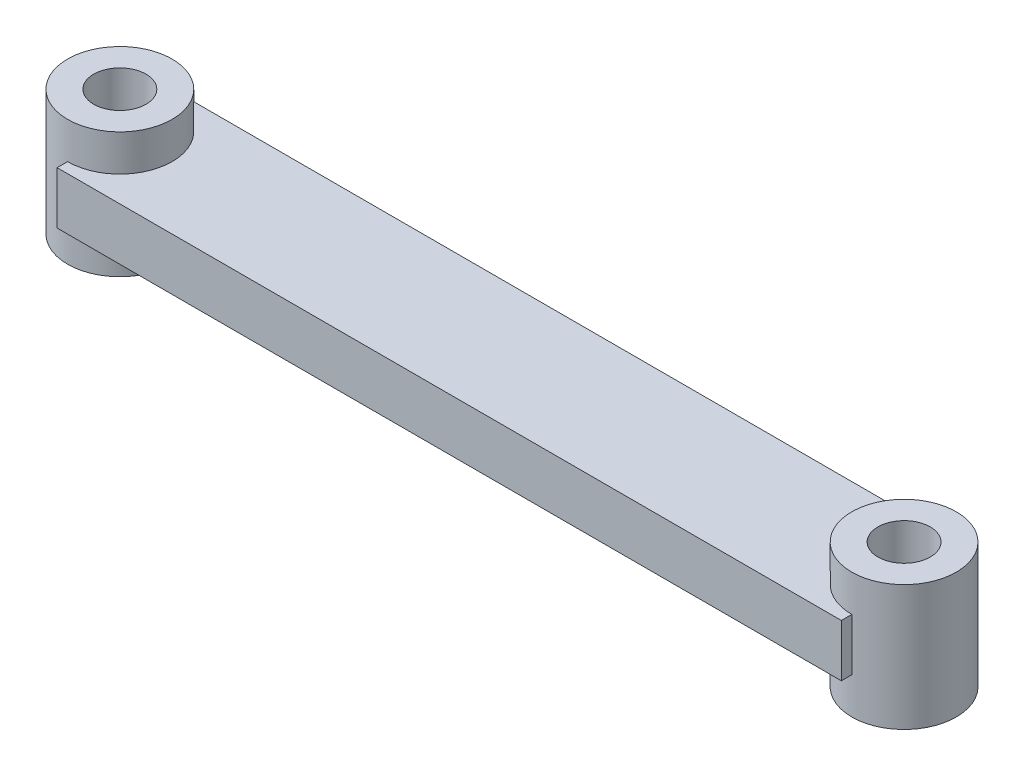
ISO-10303-21;
HEADER;
FILE_DESCRIPTION(('STEP AP214'),'2;1');
FILE_NAME('part.step','',(''),(''),'','','');
FILE_SCHEMA(('AUTOMOTIVE_DESIGN { 1 0 10303 214 1 1 1 1 }'));
ENDSEC;
DATA;
#1=APPLICATION_CONTEXT('core data for automotive mechanical design processes');
#2=APPLICATION_PROTOCOL_DEFINITION('international standard','automotive_design',2000,#1);
#3=PRODUCT_CONTEXT('',#1,'mechanical');
#4=PRODUCT('Part','Part','',(#3));
#5=PRODUCT_RELATED_PRODUCT_CATEGORY('part','',(#4));
#6=PRODUCT_DEFINITION_FORMATION('','',#4);
#7=PRODUCT_DEFINITION_CONTEXT('part definition',#1,'design');
#8=PRODUCT_DEFINITION('design','',#6,#7);
#9=PRODUCT_DEFINITION_SHAPE('','',#8);
#10=(LENGTH_UNIT() NAMED_UNIT(*) SI_UNIT(.MILLI.,.METRE.));
#11=(NAMED_UNIT(*) PLANE_ANGLE_UNIT() SI_UNIT($,.RADIAN.));
#12=(NAMED_UNIT(*) SI_UNIT($,.STERADIAN.) SOLID_ANGLE_UNIT());
#13=UNCERTAINTY_MEASURE_WITH_UNIT(LENGTH_MEASURE(1.E-05),#10,'distance_accuracy_value','');
#14=(GEOMETRIC_REPRESENTATION_CONTEXT(3) GLOBAL_UNCERTAINTY_ASSIGNED_CONTEXT((#13)) GLOBAL_UNIT_ASSIGNED_CONTEXT((#10,
#11,#12)) REPRESENTATION_CONTEXT('',''));
#15=CARTESIAN_POINT('',(0.,0.,0.));
#16=DIRECTION('',(0.,0.,1.));
#17=DIRECTION('',(1.,0.,0.));
#18=AXIS2_PLACEMENT_3D('',#15,#16,#17);
#19=CARTESIAN_POINT('',(300.,0.,0.));
#20=DIRECTION('',(-1.,0.,0.));
#21=DIRECTION('',(0.,0.,1.));
#22=AXIS2_PLACEMENT_3D('',#19,#20,#21);
#23=PLANE('',#22);
#24=DIRECTION('',(0.,0.,-1.));
#25=VECTOR('',#24,1.);
#26=CARTESIAN_POINT('',(300.,-10.,24.));
#27=LINE('',#26,#25);
#28=CARTESIAN_POINT('',(300.,-10.,24.));
#29=VERTEX_POINT('',#28);
#30=CARTESIAN_POINT('',(300.,-10.,20.));
#31=VERTEX_POINT('',#30);
#32=EDGE_CURVE('E134',#29,#31,#27,.T.);
#33=ORIENTED_EDGE('',*,*,#32,.T.);
#34=DIRECTION('',(0.,1.,0.));
#35=VECTOR('',#34,1.);
#36=CARTESIAN_POINT('',(300.,-24.,20.));
#37=LINE('',#36,#35);
#38=CARTESIAN_POINT('',(300.,10.,20.));
#39=VERTEX_POINT('',#38);
#40=EDGE_CURVE('E11',#31,#39,#37,.T.);
#41=ORIENTED_EDGE('',*,*,#40,.T.);
#42=DIRECTION('',(0.,0.,1.));
#43=VECTOR('',#42,1.);
#44=CARTESIAN_POINT('',(300.,10.,24.));
#45=LINE('',#44,#43);
#46=CARTESIAN_POINT('',(300.,10.,24.));
#47=VERTEX_POINT('',#46);
#48=EDGE_CURVE('E117',#39,#47,#45,.T.);
#49=ORIENTED_EDGE('',*,*,#48,.T.);
#50=DIRECTION('',(0.,-1.,0.));
#51=VECTOR('',#50,1.);
#52=CARTESIAN_POINT('',(300.,-10.,24.));
#53=LINE('',#52,#51);
#54=EDGE_CURVE('E121',#47,#29,#53,.T.);
#55=ORIENTED_EDGE('',*,*,#54,.T.);
#56=EDGE_LOOP('',(#33,#41,#49,#55));
#57=FACE_BOUND('',#56,.T.);
#58=ADVANCED_FACE('F39',(#57),#23,.F.);
#59=CARTESIAN_POINT('',(0.,0.,0.));
#60=DIRECTION('',(-1.,0.,0.));
#61=DIRECTION('',(0.,0.,1.));
#62=AXIS2_PLACEMENT_3D('',#59,#60,#61);
#63=PLANE('',#62);
#64=DIRECTION('',(0.,1.,0.));
#65=VECTOR('',#64,1.);
#66=CARTESIAN_POINT('',(0.,-24.,20.));
#67=LINE('',#66,#65);
#68=CARTESIAN_POINT('',(0.,-10.,20.));
#69=VERTEX_POINT('',#68);
#70=CARTESIAN_POINT('',(0.,10.,20.));
#71=VERTEX_POINT('',#70);
#72=EDGE_CURVE('E109',#69,#71,#67,.T.);
#73=ORIENTED_EDGE('',*,*,#72,.F.);
#74=DIRECTION('',(0.,0.,-1.));
#75=VECTOR('',#74,1.);
#76=CARTESIAN_POINT('',(0.,-10.,24.));
#77=LINE('',#76,#75);
#78=CARTESIAN_POINT('',(0.,-10.,24.));
#79=VERTEX_POINT('',#78);
#80=EDGE_CURVE('E144',#79,#69,#77,.T.);
#81=ORIENTED_EDGE('',*,*,#80,.F.);
#82=DIRECTION('',(0.,-1.,0.));
#83=VECTOR('',#82,1.);
#84=CARTESIAN_POINT('',(0.,-10.,24.));
#85=LINE('',#84,#83);
#86=CARTESIAN_POINT('',(0.,10.,24.));
#87=VERTEX_POINT('',#86);
#88=EDGE_CURVE('E142',#87,#79,#85,.T.);
#89=ORIENTED_EDGE('',*,*,#88,.F.);
#90=DIRECTION('',(0.,0.,1.));
#91=VECTOR('',#90,1.);
#92=CARTESIAN_POINT('',(0.,10.,24.));
#93=LINE('',#92,#91);
#94=EDGE_CURVE('E139',#71,#87,#93,.T.);
#95=ORIENTED_EDGE('',*,*,#94,.F.);
#96=EDGE_LOOP('',(#73,#81,#89,#95));
#97=FACE_BOUND('',#96,.T.);
#98=ADVANCED_FACE('F209',(#97),#63,.T.);
#99=CARTESIAN_POINT('',(300.,-10.,-24.));
#100=DIRECTION('',(0.,0.,1.));
#101=DIRECTION('',(1.,0.,0.));
#102=AXIS2_PLACEMENT_3D('',#99,#100,#101);
#103=PLANE('',#102);
#104=DIRECTION('',(0.,1.,0.));
#105=VECTOR('',#104,1.);
#106=CARTESIAN_POINT('',(0.,-10.,-24.));
#107=LINE('',#106,#105);
#108=CARTESIAN_POINT('',(0.,-10.,-24.));
#109=VERTEX_POINT('',#108);
#110=CARTESIAN_POINT('',(0.,10.,-24.));
#111=VERTEX_POINT('',#110);
#112=EDGE_CURVE('E137',#109,#111,#107,.T.);
#113=ORIENTED_EDGE('',*,*,#112,.T.);
#114=DIRECTION('',(-1.,0.,0.));
#115=VECTOR('',#114,1.);
#116=CARTESIAN_POINT('',(300.,10.,-24.));
#117=LINE('',#116,#115);
#118=CARTESIAN_POINT('',(300.,10.,-24.));
#119=VERTEX_POINT('',#118);
#120=EDGE_CURVE('E156',#119,#111,#117,.T.);
#121=ORIENTED_EDGE('',*,*,#120,.F.);
#122=DIRECTION('',(0.,1.,0.));
#123=VECTOR('',#122,1.);
#124=CARTESIAN_POINT('',(300.,-10.,-24.));
#125=LINE('',#124,#123);
#126=CARTESIAN_POINT('',(300.,-10.,-24.));
#127=VERTEX_POINT('',#126);
#128=EDGE_CURVE('E123',#127,#119,#125,.T.);
#129=ORIENTED_EDGE('',*,*,#128,.F.);
#130=DIRECTION('',(-1.,0.,0.));
#131=VECTOR('',#130,1.);
#132=CARTESIAN_POINT('',(300.,-10.,-24.));
#133=LINE('',#132,#131);
#134=EDGE_CURVE('E131',#127,#109,#133,.T.);
#135=ORIENTED_EDGE('',*,*,#134,.T.);
#136=EDGE_LOOP('',(#113,#121,#129,#135));
#137=FACE_BOUND('',#136,.T.);
#138=ADVANCED_FACE('F41',(#137),#103,.F.);
#139=CARTESIAN_POINT('',(300.,10.,24.));
#140=DIRECTION('',(0.,-1.,0.));
#141=DIRECTION('',(0.,0.,-1.));
#142=AXIS2_PLACEMENT_3D('',#139,#140,#141);
#143=PLANE('',#142);
#144=ORIENTED_EDGE('',*,*,#48,.F.);
#145=CARTESIAN_POINT('',(300.,10.,0.));
#146=DIRECTION('',(0.,-1.,0.));
#147=DIRECTION('',(0.,0.,-1.));
#148=AXIS2_PLACEMENT_3D('',#145,#146,#147);
#149=CIRCLE('',#148,20.);
#150=CARTESIAN_POINT('',(300.,10.,-20.));
#151=VERTEX_POINT('',#150);
#152=EDGE_CURVE('E106',#39,#151,#149,.T.);
#153=ORIENTED_EDGE('',*,*,#152,.T.);
#154=EDGE_CURVE('E113',#119,#151,#45,.T.);
#155=ORIENTED_EDGE('',*,*,#154,.F.);
#156=ORIENTED_EDGE('',*,*,#120,.T.);
#157=CARTESIAN_POINT('',(0.,10.,-20.));
#158=VERTEX_POINT('',#157);
#159=EDGE_CURVE('E136',#111,#158,#93,.T.);
#160=ORIENTED_EDGE('',*,*,#159,.T.);
#161=CARTESIAN_POINT('',(0.,10.,0.));
#162=DIRECTION('',(0.,-1.,0.));
#163=DIRECTION('',(0.,0.,-1.));
#164=AXIS2_PLACEMENT_3D('',#161,#162,#163);
#165=CIRCLE('',#164,20.);
#166=EDGE_CURVE('E65',#158,#71,#165,.T.);
#167=ORIENTED_EDGE('',*,*,#166,.T.);
#168=ORIENTED_EDGE('',*,*,#94,.T.);
#169=DIRECTION('',(-1.,0.,0.));
#170=VECTOR('',#169,1.);
#171=CARTESIAN_POINT('',(300.,10.,24.));
#172=LINE('',#171,#170);
#173=EDGE_CURVE('E153',#47,#87,#172,.T.);
#174=ORIENTED_EDGE('',*,*,#173,.F.);
#175=EDGE_LOOP('',(#144,#153,#155,#156,#160,#167,#168,#174));
#176=FACE_BOUND('',#175,.T.);
#177=ADVANCED_FACE('F114',(#176),#143,.F.);
#178=CARTESIAN_POINT('',(300.,-10.,24.));
#179=DIRECTION('',(0.,0.,-1.));
#180=DIRECTION('',(-1.,0.,0.));
#181=AXIS2_PLACEMENT_3D('',#178,#179,#180);
#182=PLANE('',#181);
#183=ORIENTED_EDGE('',*,*,#88,.T.);
#184=DIRECTION('',(-1.,0.,0.));
#185=VECTOR('',#184,1.);
#186=CARTESIAN_POINT('',(300.,-10.,24.));
#187=LINE('',#186,#185);
#188=EDGE_CURVE('E147',#29,#79,#187,.T.);
#189=ORIENTED_EDGE('',*,*,#188,.F.);
#190=ORIENTED_EDGE('',*,*,#54,.F.);
#191=ORIENTED_EDGE('',*,*,#173,.T.);
#192=EDGE_LOOP('',(#183,#189,#190,#191));
#193=FACE_BOUND('',#192,.T.);
#194=ADVANCED_FACE('F210',(#193),#182,.F.);
#195=CARTESIAN_POINT('',(300.,-10.,24.));
#196=DIRECTION('',(0.,1.,0.));
#197=DIRECTION('',(0.,0.,1.));
#198=AXIS2_PLACEMENT_3D('',#195,#196,#197);
#199=PLANE('',#198);
#200=CARTESIAN_POINT('',(300.,-10.,-20.));
#201=VERTEX_POINT('',#200);
#202=EDGE_CURVE('E130',#201,#127,#27,.T.);
#203=ORIENTED_EDGE('',*,*,#202,.F.);
#204=CARTESIAN_POINT('',(300.,-10.,0.));
#205=DIRECTION('',(0.,1.,0.));
#206=DIRECTION('',(0.,0.,1.));
#207=AXIS2_PLACEMENT_3D('',#204,#205,#206);
#208=CIRCLE('',#207,20.);
#209=EDGE_CURVE('E57',#201,#31,#208,.T.);
#210=ORIENTED_EDGE('',*,*,#209,.T.);
#211=ORIENTED_EDGE('',*,*,#32,.F.);
#212=ORIENTED_EDGE('',*,*,#188,.T.);
#213=ORIENTED_EDGE('',*,*,#80,.T.);
#214=CARTESIAN_POINT('',(0.,-10.,0.));
#215=DIRECTION('',(0.,1.,0.));
#216=DIRECTION('',(0.,0.,1.));
#217=AXIS2_PLACEMENT_3D('',#214,#215,#216);
#218=CIRCLE('',#217,20.);
#219=CARTESIAN_POINT('',(0.,-10.,-20.));
#220=VERTEX_POINT('',#219);
#221=EDGE_CURVE('E187',#69,#220,#218,.T.);
#222=ORIENTED_EDGE('',*,*,#221,.T.);
#223=EDGE_CURVE('E145',#220,#109,#77,.T.);
#224=ORIENTED_EDGE('',*,*,#223,.T.);
#225=ORIENTED_EDGE('',*,*,#134,.F.);
#226=EDGE_LOOP('',(#203,#210,#211,#212,#213,#222,#224,#225));
#227=FACE_BOUND('',#226,.T.);
#228=ADVANCED_FACE('F195',(#227),#199,.F.);
#229=ORIENTED_EDGE('',*,*,#154,.T.);
#230=DIRECTION('',(0.,1.,0.));
#231=VECTOR('',#230,1.);
#232=CARTESIAN_POINT('',(300.,-24.,-20.));
#233=LINE('',#232,#231);
#234=EDGE_CURVE('E48',#151,#201,#233,.F.);
#235=ORIENTED_EDGE('',*,*,#234,.T.);
#236=ORIENTED_EDGE('',*,*,#202,.T.);
#237=ORIENTED_EDGE('',*,*,#128,.T.);
#238=EDGE_LOOP('',(#229,#235,#236,#237));
#239=FACE_BOUND('',#238,.T.);
#240=ADVANCED_FACE('F122',(#239),#23,.F.);
#241=DIRECTION('',(0.,1.,0.));
#242=VECTOR('',#241,1.);
#243=CARTESIAN_POINT('',(0.,-24.,-20.));
#244=LINE('',#243,#242);
#245=EDGE_CURVE('E158',#158,#220,#244,.F.);
#246=ORIENTED_EDGE('',*,*,#245,.F.);
#247=ORIENTED_EDGE('',*,*,#159,.F.);
#248=ORIENTED_EDGE('',*,*,#112,.F.);
#249=ORIENTED_EDGE('',*,*,#223,.F.);
#250=EDGE_LOOP('',(#246,#247,#248,#249));
#251=FACE_BOUND('',#250,.T.);
#252=ADVANCED_FACE('F200',(#251),#63,.T.);
#253=CARTESIAN_POINT('',(0.,-24.,0.));
#254=DIRECTION('',(0.,1.,0.));
#255=DIRECTION('',(0.,0.,1.));
#256=AXIS2_PLACEMENT_3D('',#253,#254,#255);
#257=CYLINDRICAL_SURFACE('',#256,20.);
#258=ORIENTED_EDGE('',*,*,#221,.F.);
#259=ORIENTED_EDGE('',*,*,#72,.T.);
#260=ORIENTED_EDGE('',*,*,#166,.F.);
#261=ORIENTED_EDGE('',*,*,#245,.T.);
#262=EDGE_LOOP('',(#258,#259,#260,#261));
#263=FACE_BOUND('',#262,.T.);
#264=CARTESIAN_POINT('',(0.,-24.,0.));
#265=DIRECTION('',(0.,1.,0.));
#266=DIRECTION('',(0.,0.,1.));
#267=AXIS2_PLACEMENT_3D('',#264,#265,#266);
#268=CIRCLE('',#267,20.);
#269=CARTESIAN_POINT('',(0.,-24.,20.));
#270=VERTEX_POINT('',#269);
#271=EDGE_CURVE('E183',#270,#270,#268,.T.);
#272=ORIENTED_EDGE('',*,*,#271,.T.);
#273=EDGE_LOOP('',(#272));
#274=FACE_BOUND('',#273,.T.);
#275=CARTESIAN_POINT('',(0.,24.,0.));
#276=DIRECTION('',(0.,1.,0.));
#277=DIRECTION('',(0.,0.,1.));
#278=AXIS2_PLACEMENT_3D('',#275,#276,#277);
#279=CIRCLE('',#278,20.);
#280=CARTESIAN_POINT('',(0.,24.,20.));
#281=VERTEX_POINT('',#280);
#282=EDGE_CURVE('E120',#281,#281,#279,.T.);
#283=ORIENTED_EDGE('',*,*,#282,.F.);
#284=EDGE_LOOP('',(#283));
#285=FACE_BOUND('',#284,.T.);
#286=ADVANCED_FACE('F198',(#263,#274,#285),#257,.T.);
#287=CARTESIAN_POINT('',(0.,-24.,0.));
#288=DIRECTION('',(0.,1.,0.));
#289=DIRECTION('',(0.,0.,1.));
#290=AXIS2_PLACEMENT_3D('',#287,#288,#289);
#291=PLANE('',#290);
#292=CARTESIAN_POINT('',(0.,-24.,0.));
#293=DIRECTION('',(0.,1.,0.));
#294=DIRECTION('',(0.,0.,1.));
#295=AXIS2_PLACEMENT_3D('',#292,#293,#294);
#296=CIRCLE('',#295,10.);
#297=CARTESIAN_POINT('',(0.,-24.,10.));
#298=VERTEX_POINT('',#297);
#299=EDGE_CURVE('E163',#298,#298,#296,.T.);
#300=ORIENTED_EDGE('',*,*,#299,.T.);
#301=EDGE_LOOP('',(#300));
#302=FACE_BOUND('',#301,.T.);
#303=ORIENTED_EDGE('',*,*,#271,.F.);
#304=EDGE_LOOP('',(#303));
#305=FACE_BOUND('',#304,.T.);
#306=ADVANCED_FACE('F221',(#302,#305),#291,.F.);
#307=CARTESIAN_POINT('',(0.,24.,0.));
#308=DIRECTION('',(0.,1.,0.));
#309=DIRECTION('',(0.,0.,1.));
#310=AXIS2_PLACEMENT_3D('',#307,#308,#309);
#311=PLANE('',#310);
#312=CARTESIAN_POINT('',(0.,24.,0.));
#313=DIRECTION('',(0.,1.,0.));
#314=DIRECTION('',(0.,0.,1.));
#315=AXIS2_PLACEMENT_3D('',#312,#313,#314);
#316=CIRCLE('',#315,10.);
#317=CARTESIAN_POINT('',(0.,24.,10.));
#318=VERTEX_POINT('',#317);
#319=EDGE_CURVE('E165',#318,#318,#316,.T.);
#320=ORIENTED_EDGE('',*,*,#319,.F.);
#321=EDGE_LOOP('',(#320));
#322=FACE_BOUND('',#321,.T.);
#323=ORIENTED_EDGE('',*,*,#282,.T.);
#324=EDGE_LOOP('',(#323));
#325=FACE_BOUND('',#324,.T.);
#326=ADVANCED_FACE('F234',(#322,#325),#311,.T.);
#327=CARTESIAN_POINT('',(300.,-24.,0.));
#328=DIRECTION('',(0.,1.,0.));
#329=DIRECTION('',(0.,0.,1.));
#330=AXIS2_PLACEMENT_3D('',#327,#328,#329);
#331=CYLINDRICAL_SURFACE('',#330,20.);
#332=CARTESIAN_POINT('',(300.,24.,0.));
#333=DIRECTION('',(0.,1.,0.));
#334=DIRECTION('',(0.,0.,1.));
#335=AXIS2_PLACEMENT_3D('',#332,#333,#334);
#336=CIRCLE('',#335,20.);
#337=CARTESIAN_POINT('',(300.,24.,20.));
#338=VERTEX_POINT('',#337);
#339=EDGE_CURVE('E166',#338,#338,#336,.T.);
#340=ORIENTED_EDGE('',*,*,#339,.F.);
#341=EDGE_LOOP('',(#340));
#342=FACE_BOUND('',#341,.T.);
#343=CARTESIAN_POINT('',(300.,-24.,0.));
#344=DIRECTION('',(0.,1.,0.));
#345=DIRECTION('',(0.,0.,1.));
#346=AXIS2_PLACEMENT_3D('',#343,#344,#345);
#347=CIRCLE('',#346,20.);
#348=CARTESIAN_POINT('',(300.,-24.,20.));
#349=VERTEX_POINT('',#348);
#350=EDGE_CURVE('E179',#349,#349,#347,.T.);
#351=ORIENTED_EDGE('',*,*,#350,.T.);
#352=EDGE_LOOP('',(#351));
#353=FACE_BOUND('',#352,.T.);
#354=ORIENTED_EDGE('',*,*,#40,.F.);
#355=ORIENTED_EDGE('',*,*,#209,.F.);
#356=ORIENTED_EDGE('',*,*,#234,.F.);
#357=ORIENTED_EDGE('',*,*,#152,.F.);
#358=EDGE_LOOP('',(#354,#355,#356,#357));
#359=FACE_BOUND('',#358,.T.);
#360=ADVANCED_FACE('F104',(#342,#353,#359),#331,.T.);
#361=CARTESIAN_POINT('',(300.,-24.,0.));
#362=DIRECTION('',(0.,1.,0.));
#363=DIRECTION('',(0.,0.,1.));
#364=AXIS2_PLACEMENT_3D('',#361,#362,#363);
#365=PLANE('',#364);
#366=CARTESIAN_POINT('',(300.,-24.,0.));
#367=DIRECTION('',(0.,1.,0.));
#368=DIRECTION('',(0.,0.,1.));
#369=AXIS2_PLACEMENT_3D('',#366,#367,#368);
#370=CIRCLE('',#369,10.);
#371=CARTESIAN_POINT('',(300.,-24.,10.));
#372=VERTEX_POINT('',#371);
#373=EDGE_CURVE('E164',#372,#372,#370,.T.);
#374=ORIENTED_EDGE('',*,*,#373,.T.);
#375=EDGE_LOOP('',(#374));
#376=FACE_BOUND('',#375,.T.);
#377=ORIENTED_EDGE('',*,*,#350,.F.);
#378=EDGE_LOOP('',(#377));
#379=FACE_BOUND('',#378,.T.);
#380=ADVANCED_FACE('F238',(#376,#379),#365,.F.);
#381=CARTESIAN_POINT('',(300.,24.,0.));
#382=DIRECTION('',(0.,1.,0.));
#383=DIRECTION('',(0.,0.,1.));
#384=AXIS2_PLACEMENT_3D('',#381,#382,#383);
#385=PLANE('',#384);
#386=CARTESIAN_POINT('',(300.,24.,0.));
#387=DIRECTION('',(0.,1.,0.));
#388=DIRECTION('',(0.,0.,1.));
#389=AXIS2_PLACEMENT_3D('',#386,#387,#388);
#390=CIRCLE('',#389,10.);
#391=CARTESIAN_POINT('',(300.,24.,10.));
#392=VERTEX_POINT('',#391);
#393=EDGE_CURVE('E43',#392,#392,#390,.T.);
#394=ORIENTED_EDGE('',*,*,#393,.F.);
#395=EDGE_LOOP('',(#394));
#396=FACE_BOUND('',#395,.T.);
#397=ORIENTED_EDGE('',*,*,#339,.T.);
#398=EDGE_LOOP('',(#397));
#399=FACE_BOUND('',#398,.T.);
#400=ADVANCED_FACE('F245',(#396,#399),#385,.T.);
#401=CARTESIAN_POINT('',(0.,-50.,0.));
#402=DIRECTION('',(0.,1.,0.));
#403=DIRECTION('',(0.,0.,1.));
#404=AXIS2_PLACEMENT_3D('',#401,#402,#403);
#405=CYLINDRICAL_SURFACE('',#404,10.);
#406=ORIENTED_EDGE('',*,*,#319,.T.);
#407=EDGE_LOOP('',(#406));
#408=FACE_BOUND('',#407,.T.);
#409=ORIENTED_EDGE('',*,*,#299,.F.);
#410=EDGE_LOOP('',(#409));
#411=FACE_BOUND('',#410,.T.);
#412=ADVANCED_FACE('F250',(#408,#411),#405,.F.);
#413=CARTESIAN_POINT('',(300.,-50.,0.));
#414=DIRECTION('',(0.,1.,0.));
#415=DIRECTION('',(0.,0.,1.));
#416=AXIS2_PLACEMENT_3D('',#413,#414,#415);
#417=CYLINDRICAL_SURFACE('',#416,10.);
#418=ORIENTED_EDGE('',*,*,#393,.T.);
#419=EDGE_LOOP('',(#418));
#420=FACE_BOUND('',#419,.T.);
#421=ORIENTED_EDGE('',*,*,#373,.F.);
#422=EDGE_LOOP('',(#421));
#423=FACE_BOUND('',#422,.T.);
#424=ADVANCED_FACE('F253',(#420,#423),#417,.F.);
#425=CLOSED_SHELL('',(#58,#98,#138,#177,#194,#228,#240,#252,#286,#306,#326,#360,#380,#400,#412,#424));
#426=MANIFOLD_SOLID_BREP('B2',#425);
#427=ADVANCED_BREP_SHAPE_REPRESENTATION('',(#18,#426),#14);
#428=SHAPE_DEFINITION_REPRESENTATION(#9,#427);
ENDSEC;
END-ISO-10303-21;
